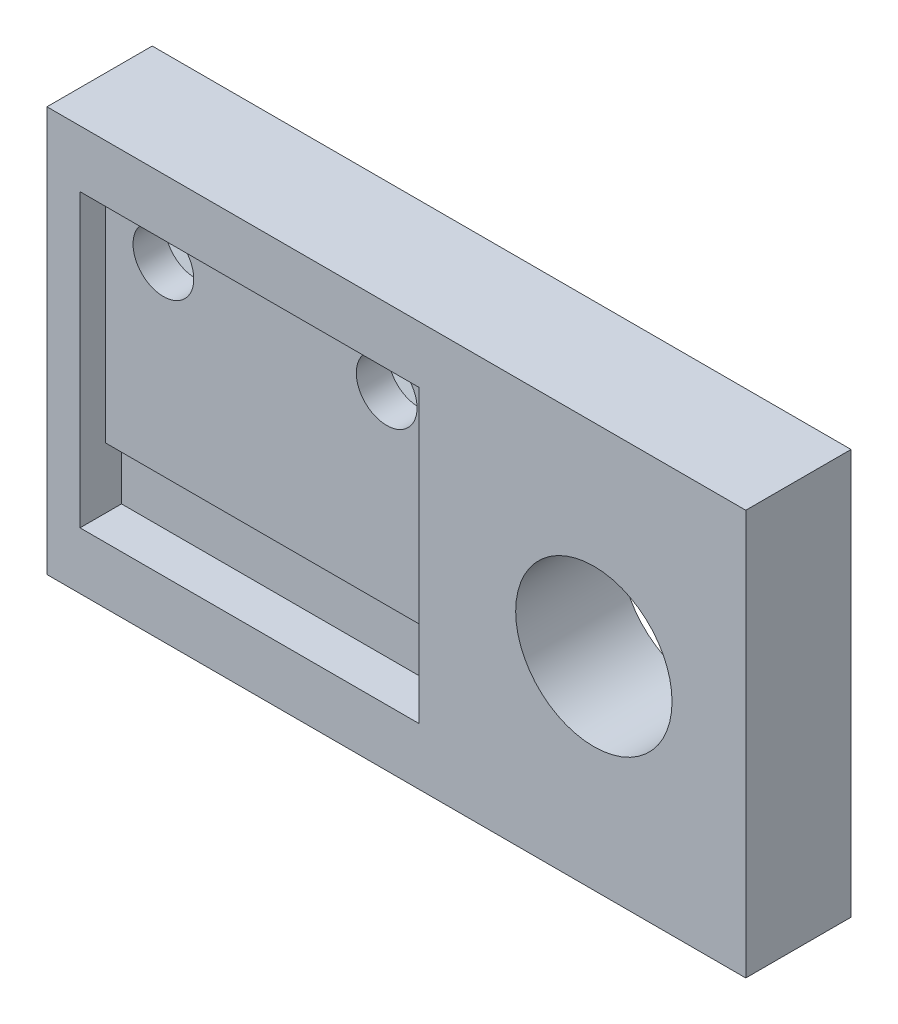
ISO-10303-21;
HEADER;
FILE_DESCRIPTION(('STEP AP214'),'2;1');
FILE_NAME('part.step','',(''),(''),'','','');
FILE_SCHEMA(('AUTOMOTIVE_DESIGN { 1 0 10303 214 1 1 1 1 }'));
ENDSEC;
DATA;
#1=APPLICATION_CONTEXT('core data for automotive mechanical design processes');
#2=APPLICATION_PROTOCOL_DEFINITION('international standard','automotive_design',2000,#1);
#3=PRODUCT_CONTEXT('',#1,'mechanical');
#4=PRODUCT('Part','Part','',(#3));
#5=PRODUCT_RELATED_PRODUCT_CATEGORY('part','',(#4));
#6=PRODUCT_DEFINITION_FORMATION('','',#4);
#7=PRODUCT_DEFINITION_CONTEXT('part definition',#1,'design');
#8=PRODUCT_DEFINITION('design','',#6,#7);
#9=PRODUCT_DEFINITION_SHAPE('','',#8);
#10=(LENGTH_UNIT() NAMED_UNIT(*) SI_UNIT(.MILLI.,.METRE.));
#11=(NAMED_UNIT(*) PLANE_ANGLE_UNIT() SI_UNIT($,.RADIAN.));
#12=(NAMED_UNIT(*) SI_UNIT($,.STERADIAN.) SOLID_ANGLE_UNIT());
#13=UNCERTAINTY_MEASURE_WITH_UNIT(LENGTH_MEASURE(1.E-05),#10,'distance_accuracy_value','');
#14=(GEOMETRIC_REPRESENTATION_CONTEXT(3) GLOBAL_UNCERTAINTY_ASSIGNED_CONTEXT((#13)) GLOBAL_UNIT_ASSIGNED_CONTEXT((#10,
#11,#12)) REPRESENTATION_CONTEXT('',''));
#15=CARTESIAN_POINT('',(0.,0.,0.));
#16=DIRECTION('',(0.,0.,1.));
#17=DIRECTION('',(1.,0.,0.));
#18=AXIS2_PLACEMENT_3D('',#15,#16,#17);
#19=CARTESIAN_POINT('',(0.,0.,0.));
#20=DIRECTION('',(0.,0.,-1.));
#21=DIRECTION('',(-1.,0.,0.));
#22=AXIS2_PLACEMENT_3D('',#19,#20,#21);
#23=PLANE('',#22);
#24=CARTESIAN_POINT('',(19.7,19.05,0.));
#25=DIRECTION('',(0.,0.,1.));
#26=DIRECTION('',(1.,0.,0.));
#27=AXIS2_PLACEMENT_3D('',#24,#25,#26);
#28=CIRCLE('',#27,1.9039967);
#29=CARTESIAN_POINT('',(21.6039967,19.05,0.));
#30=VERTEX_POINT('',#29);
#31=EDGE_CURVE('E428',#30,#30,#28,.T.);
#32=ORIENTED_EDGE('',*,*,#31,.T.);
#33=EDGE_LOOP('',(#32));
#34=FACE_BOUND('',#33,.T.);
#35=DIRECTION('',(-0.866025403784438,-0.5,0.));
#36=VECTOR('',#35,1.);
#37=CARTESIAN_POINT('',(22.8309945,17.2423194825938,0.));
#38=LINE('',#37,#36);
#39=CARTESIAN_POINT('',(22.8309945,17.2423194825938,0.));
#40=VERTEX_POINT('',#39);
#41=CARTESIAN_POINT('',(19.7,15.4346389651875,0.));
#42=VERTEX_POINT('',#41);
#43=EDGE_CURVE('E302',#40,#42,#38,.T.);
#44=ORIENTED_EDGE('',*,*,#43,.T.);
#45=DIRECTION('',(-0.866025403784438,0.5,0.));
#46=VECTOR('',#45,1.);
#47=CARTESIAN_POINT('',(19.7,15.4346389651875,0.));
#48=LINE('',#47,#46);
#49=CARTESIAN_POINT('',(16.5690055,17.2423194825938,0.));
#50=VERTEX_POINT('',#49);
#51=EDGE_CURVE('E297',#42,#50,#48,.T.);
#52=ORIENTED_EDGE('',*,*,#51,.T.);
#53=DIRECTION('',(0.,1.,0.));
#54=VECTOR('',#53,1.);
#55=CARTESIAN_POINT('',(16.5690055,17.2423194825938,0.));
#56=LINE('',#55,#54);
#57=CARTESIAN_POINT('',(16.5690055,20.8576805174062,0.));
#58=VERTEX_POINT('',#57);
#59=EDGE_CURVE('E321',#50,#58,#56,.T.);
#60=ORIENTED_EDGE('',*,*,#59,.T.);
#61=DIRECTION('',(0.866025403784439,0.5,0.));
#62=VECTOR('',#61,1.);
#63=CARTESIAN_POINT('',(16.5690055,20.8576805174062,0.));
#64=LINE('',#63,#62);
#65=CARTESIAN_POINT('',(19.7,22.6653610348125,0.));
#66=VERTEX_POINT('',#65);
#67=EDGE_CURVE('E325',#58,#66,#64,.T.);
#68=ORIENTED_EDGE('',*,*,#67,.T.);
#69=DIRECTION('',(0.866025403784439,-0.5,0.));
#70=VECTOR('',#69,1.);
#71=CARTESIAN_POINT('',(19.7,22.6653610348125,0.));
#72=LINE('',#71,#70);
#73=CARTESIAN_POINT('',(22.8309945,20.8576805174062,0.));
#74=VERTEX_POINT('',#73);
#75=EDGE_CURVE('E329',#66,#74,#72,.T.);
#76=ORIENTED_EDGE('',*,*,#75,.T.);
#77=DIRECTION('',(0.,-1.,0.));
#78=VECTOR('',#77,1.);
#79=CARTESIAN_POINT('',(22.8309945,20.8576805174062,0.));
#80=LINE('',#79,#78);
#81=EDGE_CURVE('E333',#74,#40,#80,.T.);
#82=ORIENTED_EDGE('',*,*,#81,.T.);
#83=EDGE_LOOP('',(#44,#52,#60,#68,#76,#82));
#84=FACE_BOUND('',#83,.T.);
#85=ADVANCED_FACE('F39',(#34,#84),#23,.T.);
#86=CARTESIAN_POINT('',(5.7,19.05,0.));
#87=DIRECTION('',(0.,0.,1.));
#88=DIRECTION('',(1.,0.,0.));
#89=AXIS2_PLACEMENT_3D('',#86,#87,#88);
#90=CIRCLE('',#89,1.9039967);
#91=CARTESIAN_POINT('',(7.6039967,19.05,0.));
#92=VERTEX_POINT('',#91);
#93=EDGE_CURVE('E433',#92,#92,#90,.T.);
#94=ORIENTED_EDGE('',*,*,#93,.T.);
#95=EDGE_LOOP('',(#94));
#96=FACE_BOUND('',#95,.T.);
#97=DIRECTION('',(-0.866025403784438,0.5,0.));
#98=VECTOR('',#97,1.);
#99=CARTESIAN_POINT('',(5.7,15.4346389651875,0.));
#100=LINE('',#99,#98);
#101=CARTESIAN_POINT('',(5.7,15.4346389651875,0.));
#102=VERTEX_POINT('',#101);
#103=CARTESIAN_POINT('',(2.5690055,17.2423194825938,0.));
#104=VERTEX_POINT('',#103);
#105=EDGE_CURVE('E241',#102,#104,#100,.T.);
#106=ORIENTED_EDGE('',*,*,#105,.T.);
#107=DIRECTION('',(0.,1.,0.));
#108=VECTOR('',#107,1.);
#109=CARTESIAN_POINT('',(2.5690055,17.2423194825938,0.));
#110=LINE('',#109,#108);
#111=CARTESIAN_POINT('',(2.5690055,20.8576805174062,0.));
#112=VERTEX_POINT('',#111);
#113=EDGE_CURVE('E234',#104,#112,#110,.T.);
#114=ORIENTED_EDGE('',*,*,#113,.T.);
#115=DIRECTION('',(0.866025403784439,0.5,0.));
#116=VECTOR('',#115,1.);
#117=CARTESIAN_POINT('',(2.5690055,20.8576805174062,0.));
#118=LINE('',#117,#116);
#119=CARTESIAN_POINT('',(5.69999999999999,22.6653610348125,0.));
#120=VERTEX_POINT('',#119);
#121=EDGE_CURVE('E260',#112,#120,#118,.T.);
#122=ORIENTED_EDGE('',*,*,#121,.T.);
#123=DIRECTION('',(0.866025403784439,-0.5,0.));
#124=VECTOR('',#123,1.);
#125=CARTESIAN_POINT('',(5.69999999999999,22.6653610348125,0.));
#126=LINE('',#125,#124);
#127=CARTESIAN_POINT('',(8.83099449999999,20.8576805174062,0.));
#128=VERTEX_POINT('',#127);
#129=EDGE_CURVE('E264',#120,#128,#126,.T.);
#130=ORIENTED_EDGE('',*,*,#129,.T.);
#131=DIRECTION('',(0.,-1.,0.));
#132=VECTOR('',#131,1.);
#133=CARTESIAN_POINT('',(8.83099449999999,20.8576805174062,0.));
#134=LINE('',#133,#132);
#135=CARTESIAN_POINT('',(8.83099449999999,17.2423194825938,0.));
#136=VERTEX_POINT('',#135);
#137=EDGE_CURVE('E268',#128,#136,#134,.T.);
#138=ORIENTED_EDGE('',*,*,#137,.T.);
#139=DIRECTION('',(-0.866025403784438,-0.5,0.));
#140=VECTOR('',#139,1.);
#141=CARTESIAN_POINT('',(8.83099449999999,17.2423194825938,0.));
#142=LINE('',#141,#140);
#143=EDGE_CURVE('E272',#136,#102,#142,.T.);
#144=ORIENTED_EDGE('',*,*,#143,.T.);
#145=EDGE_LOOP('',(#106,#114,#122,#130,#138,#144));
#146=FACE_BOUND('',#145,.T.);
#147=ADVANCED_FACE('F506',(#96,#146),#23,.T.);
#148=CARTESIAN_POINT('',(0.,0.,2.));
#149=DIRECTION('',(0.,0.,-1.));
#150=DIRECTION('',(-1.,0.,0.));
#151=AXIS2_PLACEMENT_3D('',#148,#149,#150);
#152=PLANE('',#151);
#153=DIRECTION('',(0.,-1.,0.));
#154=VECTOR('',#153,1.);
#155=CARTESIAN_POINT('',(2.073,3.573,2.));
#156=LINE('',#155,#154);
#157=CARTESIAN_POINT('',(2.073,21.827,2.));
#158=VERTEX_POINT('',#157);
#159=CARTESIAN_POINT('',(2.073,7.383,2.));
#160=VERTEX_POINT('',#159);
#161=EDGE_CURVE('E387',#158,#160,#156,.T.);
#162=ORIENTED_EDGE('',*,*,#161,.T.);
#163=DIRECTION('',(-1.,0.,0.));
#164=VECTOR('',#163,1.);
#165=CARTESIAN_POINT('',(2.073,7.383,2.));
#166=LINE('',#165,#164);
#167=CARTESIAN_POINT('',(23.327,7.383,2.));
#168=VERTEX_POINT('',#167);
#169=EDGE_CURVE('E220',#168,#160,#166,.T.);
#170=ORIENTED_EDGE('',*,*,#169,.F.);
#171=DIRECTION('',(0.,1.,0.));
#172=VECTOR('',#171,1.);
#173=CARTESIAN_POINT('',(23.327,3.573,2.));
#174=LINE('',#173,#172);
#175=CARTESIAN_POINT('',(23.327,21.827,2.));
#176=VERTEX_POINT('',#175);
#177=EDGE_CURVE('E382',#168,#176,#174,.T.);
#178=ORIENTED_EDGE('',*,*,#177,.T.);
#179=DIRECTION('',(-1.,0.,0.));
#180=VECTOR('',#179,1.);
#181=CARTESIAN_POINT('',(2.073,21.827,2.));
#182=LINE('',#181,#180);
#183=EDGE_CURVE('E397',#176,#158,#182,.T.);
#184=ORIENTED_EDGE('',*,*,#183,.T.);
#185=EDGE_LOOP('',(#162,#170,#178,#184));
#186=FACE_BOUND('',#185,.T.);
#187=CARTESIAN_POINT('',(5.7,19.05,2.));
#188=DIRECTION('',(0.,0.,1.));
#189=DIRECTION('',(1.,0.,0.));
#190=AXIS2_PLACEMENT_3D('',#187,#188,#189);
#191=CIRCLE('',#190,1.9039967);
#192=CARTESIAN_POINT('',(7.6039967,19.05,2.));
#193=VERTEX_POINT('',#192);
#194=EDGE_CURVE('E437',#193,#193,#191,.T.);
#195=ORIENTED_EDGE('',*,*,#194,.F.);
#196=EDGE_LOOP('',(#195));
#197=FACE_BOUND('',#196,.T.);
#198=CARTESIAN_POINT('',(19.7,19.05,2.));
#199=DIRECTION('',(0.,0.,1.));
#200=DIRECTION('',(1.,0.,0.));
#201=AXIS2_PLACEMENT_3D('',#198,#199,#200);
#202=CIRCLE('',#201,1.9039967);
#203=CARTESIAN_POINT('',(21.6039967,19.05,2.));
#204=VERTEX_POINT('',#203);
#205=EDGE_CURVE('E429',#204,#204,#202,.T.);
#206=ORIENTED_EDGE('',*,*,#205,.F.);
#207=EDGE_LOOP('',(#206));
#208=FACE_BOUND('',#207,.T.);
#209=ADVANCED_FACE('F531',(#186,#197,#208),#152,.F.);
#210=CARTESIAN_POINT('',(0.,0.,2.));
#211=DIRECTION('',(1.,0.,0.));
#212=DIRECTION('',(0.,0.,-1.));
#213=AXIS2_PLACEMENT_3D('',#210,#211,#212);
#214=PLANE('',#213);
#215=DIRECTION('',(0.,0.,-1.));
#216=VECTOR('',#215,1.);
#217=CARTESIAN_POINT('',(0.,25.4,2.));
#218=LINE('',#217,#216);
#219=CARTESIAN_POINT('',(0.,25.4,3.6));
#220=VERTEX_POINT('',#219);
#221=CARTESIAN_POINT('',(0.,25.4,-3.));
#222=VERTEX_POINT('',#221);
#223=EDGE_CURVE('E441',#220,#222,#218,.T.);
#224=ORIENTED_EDGE('',*,*,#223,.T.);
#225=DIRECTION('',(0.,1.,0.));
#226=VECTOR('',#225,1.);
#227=CARTESIAN_POINT('',(0.,0.,-3.));
#228=LINE('',#227,#226);
#229=CARTESIAN_POINT('',(0.,0.,-3.));
#230=VERTEX_POINT('',#229);
#231=EDGE_CURVE('E366',#230,#222,#228,.T.);
#232=ORIENTED_EDGE('',*,*,#231,.F.);
#233=DIRECTION('',(0.,0.,-1.));
#234=VECTOR('',#233,1.);
#235=CARTESIAN_POINT('',(0.,0.,2.));
#236=LINE('',#235,#234);
#237=CARTESIAN_POINT('',(0.,0.,3.6));
#238=VERTEX_POINT('',#237);
#239=EDGE_CURVE('E11',#238,#230,#236,.T.);
#240=ORIENTED_EDGE('',*,*,#239,.F.);
#241=DIRECTION('',(0.,-1.,0.));
#242=VECTOR('',#241,1.);
#243=CARTESIAN_POINT('',(0.,25.4,3.6));
#244=LINE('',#243,#242);
#245=EDGE_CURVE('E416',#220,#238,#244,.T.);
#246=ORIENTED_EDGE('',*,*,#245,.F.);
#247=EDGE_LOOP('',(#224,#232,#240,#246));
#248=FACE_BOUND('',#247,.T.);
#249=ADVANCED_FACE('F41',(#248),#214,.F.);
#250=CARTESIAN_POINT('',(0.,0.,2.));
#251=DIRECTION('',(0.,1.,0.));
#252=DIRECTION('',(0.,0.,1.));
#253=AXIS2_PLACEMENT_3D('',#250,#251,#252);
#254=PLANE('',#253);
#255=ORIENTED_EDGE('',*,*,#239,.T.);
#256=DIRECTION('',(-1.,0.,0.));
#257=VECTOR('',#256,1.);
#258=CARTESIAN_POINT('',(43.815,0.,-3.));
#259=LINE('',#258,#257);
#260=CARTESIAN_POINT('',(43.815,0.,-3.));
#261=VERTEX_POINT('',#260);
#262=EDGE_CURVE('E362',#261,#230,#259,.T.);
#263=ORIENTED_EDGE('',*,*,#262,.F.);
#264=DIRECTION('',(0.,0.,-1.));
#265=VECTOR('',#264,1.);
#266=CARTESIAN_POINT('',(43.815,0.,2.));
#267=LINE('',#266,#265);
#268=CARTESIAN_POINT('',(43.815,0.,3.6));
#269=VERTEX_POINT('',#268);
#270=EDGE_CURVE('E48',#269,#261,#267,.T.);
#271=ORIENTED_EDGE('',*,*,#270,.F.);
#272=DIRECTION('',(1.,0.,0.));
#273=VECTOR('',#272,1.);
#274=CARTESIAN_POINT('',(0.,0.,3.6));
#275=LINE('',#274,#273);
#276=EDGE_CURVE('E420',#238,#269,#275,.T.);
#277=ORIENTED_EDGE('',*,*,#276,.F.);
#278=EDGE_LOOP('',(#255,#263,#271,#277));
#279=FACE_BOUND('',#278,.T.);
#280=ADVANCED_FACE('F461',(#279),#254,.F.);
#281=CARTESIAN_POINT('',(43.815,0.,2.));
#282=DIRECTION('',(-1.,0.,0.));
#283=DIRECTION('',(0.,0.,1.));
#284=AXIS2_PLACEMENT_3D('',#281,#282,#283);
#285=PLANE('',#284);
#286=ORIENTED_EDGE('',*,*,#270,.T.);
#287=DIRECTION('',(0.,-1.,0.));
#288=VECTOR('',#287,1.);
#289=CARTESIAN_POINT('',(43.815,25.4,-3.));
#290=LINE('',#289,#288);
#291=CARTESIAN_POINT('',(43.815,25.4,-3.));
#292=VERTEX_POINT('',#291);
#293=EDGE_CURVE('E374',#292,#261,#290,.T.);
#294=ORIENTED_EDGE('',*,*,#293,.F.);
#295=DIRECTION('',(0.,0.,-1.));
#296=VECTOR('',#295,1.);
#297=CARTESIAN_POINT('',(43.815,25.4,2.));
#298=LINE('',#297,#296);
#299=CARTESIAN_POINT('',(43.815,25.4,3.6));
#300=VERTEX_POINT('',#299);
#301=EDGE_CURVE('E447',#300,#292,#298,.T.);
#302=ORIENTED_EDGE('',*,*,#301,.F.);
#303=DIRECTION('',(0.,1.,0.));
#304=VECTOR('',#303,1.);
#305=CARTESIAN_POINT('',(43.815,0.,3.6));
#306=LINE('',#305,#304);
#307=EDGE_CURVE('E424',#269,#300,#306,.T.);
#308=ORIENTED_EDGE('',*,*,#307,.F.);
#309=EDGE_LOOP('',(#286,#294,#302,#308));
#310=FACE_BOUND('',#309,.T.);
#311=ADVANCED_FACE('F453',(#310),#285,.F.);
#312=CARTESIAN_POINT('',(0.,25.4,2.));
#313=DIRECTION('',(0.,-1.,0.));
#314=DIRECTION('',(0.,0.,-1.));
#315=AXIS2_PLACEMENT_3D('',#312,#313,#314);
#316=PLANE('',#315);
#317=ORIENTED_EDGE('',*,*,#301,.T.);
#318=DIRECTION('',(1.,0.,0.));
#319=VECTOR('',#318,1.);
#320=CARTESIAN_POINT('',(0.,25.4,-3.));
#321=LINE('',#320,#319);
#322=EDGE_CURVE('E370',#222,#292,#321,.T.);
#323=ORIENTED_EDGE('',*,*,#322,.F.);
#324=ORIENTED_EDGE('',*,*,#223,.F.);
#325=DIRECTION('',(-1.,0.,0.));
#326=VECTOR('',#325,1.);
#327=CARTESIAN_POINT('',(43.815,25.4,3.6));
#328=LINE('',#327,#326);
#329=EDGE_CURVE('E412',#300,#220,#328,.T.);
#330=ORIENTED_EDGE('',*,*,#329,.F.);
#331=EDGE_LOOP('',(#317,#323,#324,#330));
#332=FACE_BOUND('',#331,.T.);
#333=ADVANCED_FACE('F466',(#332),#316,.F.);
#334=CARTESIAN_POINT('',(5.7,19.05,2.));
#335=DIRECTION('',(0.,0.,-1.));
#336=DIRECTION('',(-1.,0.,0.));
#337=AXIS2_PLACEMENT_3D('',#334,#335,#336);
#338=CYLINDRICAL_SURFACE('',#337,1.9039967);
#339=ORIENTED_EDGE('',*,*,#194,.T.);
#340=EDGE_LOOP('',(#339));
#341=FACE_BOUND('',#340,.T.);
#342=ORIENTED_EDGE('',*,*,#93,.F.);
#343=EDGE_LOOP('',(#342));
#344=FACE_BOUND('',#343,.T.);
#345=ADVANCED_FACE('F539',(#341,#344),#338,.F.);
#346=CARTESIAN_POINT('',(19.7,19.05,2.));
#347=DIRECTION('',(0.,0.,-1.));
#348=DIRECTION('',(-1.,0.,0.));
#349=AXIS2_PLACEMENT_3D('',#346,#347,#348);
#350=CYLINDRICAL_SURFACE('',#349,1.9039967);
#351=ORIENTED_EDGE('',*,*,#205,.T.);
#352=EDGE_LOOP('',(#351));
#353=FACE_BOUND('',#352,.T.);
#354=ORIENTED_EDGE('',*,*,#31,.F.);
#355=EDGE_LOOP('',(#354));
#356=FACE_BOUND('',#355,.T.);
#357=ADVANCED_FACE('F480',(#353,#356),#350,.F.);
#358=CARTESIAN_POINT('',(34.29,12.7,2.));
#359=DIRECTION('',(0.,0.,-1.));
#360=DIRECTION('',(-1.,0.,0.));
#361=AXIS2_PLACEMENT_3D('',#358,#359,#360);
#362=CYLINDRICAL_SURFACE('',#361,4.90220000000001);
#363=CARTESIAN_POINT('',(34.29,12.7,3.6));
#364=DIRECTION('',(0.,0.,1.));
#365=DIRECTION('',(1.,0.,0.));
#366=AXIS2_PLACEMENT_3D('',#363,#364,#365);
#367=CIRCLE('',#366,4.90220000000001);
#368=CARTESIAN_POINT('',(39.1922,12.7,3.6));
#369=VERTEX_POINT('',#368);
#370=EDGE_CURVE('E378',#369,#369,#367,.T.);
#371=ORIENTED_EDGE('',*,*,#370,.T.);
#372=EDGE_LOOP('',(#371));
#373=FACE_BOUND('',#372,.T.);
#374=CARTESIAN_POINT('',(34.29,12.7,-3.));
#375=DIRECTION('',(0.,0.,-1.));
#376=DIRECTION('',(-1.,0.,0.));
#377=AXIS2_PLACEMENT_3D('',#374,#375,#376);
#378=CIRCLE('',#377,4.9022);
#379=CARTESIAN_POINT('',(29.3878,12.7,-3.));
#380=VERTEX_POINT('',#379);
#381=EDGE_CURVE('E358',#380,#380,#378,.T.);
#382=ORIENTED_EDGE('',*,*,#381,.T.);
#383=EDGE_LOOP('',(#382));
#384=FACE_BOUND('',#383,.T.);
#385=ADVANCED_FACE('F473',(#373,#384),#362,.F.);
#386=CARTESIAN_POINT('',(0.,0.,3.6));
#387=DIRECTION('',(0.,0.,1.));
#388=DIRECTION('',(1.,0.,0.));
#389=AXIS2_PLACEMENT_3D('',#386,#387,#388);
#390=PLANE('',#389);
#391=DIRECTION('',(-1.,0.,0.));
#392=VECTOR('',#391,1.);
#393=CARTESIAN_POINT('',(2.073,21.827,3.6));
#394=LINE('',#393,#392);
#395=CARTESIAN_POINT('',(23.327,21.827,3.6));
#396=VERTEX_POINT('',#395);
#397=CARTESIAN_POINT('',(2.073,21.827,3.6));
#398=VERTEX_POINT('',#397);
#399=EDGE_CURVE('E386',#396,#398,#394,.T.);
#400=ORIENTED_EDGE('',*,*,#399,.F.);
#401=DIRECTION('',(0.,1.,0.));
#402=VECTOR('',#401,1.);
#403=CARTESIAN_POINT('',(23.327,3.573,3.6));
#404=LINE('',#403,#402);
#405=CARTESIAN_POINT('',(23.327,3.573,3.6));
#406=VERTEX_POINT('',#405);
#407=EDGE_CURVE('E383',#406,#396,#404,.T.);
#408=ORIENTED_EDGE('',*,*,#407,.F.);
#409=DIRECTION('',(1.,0.,0.));
#410=VECTOR('',#409,1.);
#411=CARTESIAN_POINT('',(2.073,3.573,3.6));
#412=LINE('',#411,#410);
#413=CARTESIAN_POINT('',(2.073,3.573,3.6));
#414=VERTEX_POINT('',#413);
#415=EDGE_CURVE('E392',#414,#406,#412,.T.);
#416=ORIENTED_EDGE('',*,*,#415,.F.);
#417=DIRECTION('',(0.,-1.,0.));
#418=VECTOR('',#417,1.);
#419=CARTESIAN_POINT('',(2.073,3.573,3.6));
#420=LINE('',#419,#418);
#421=EDGE_CURVE('E199',#398,#414,#420,.T.);
#422=ORIENTED_EDGE('',*,*,#421,.F.);
#423=EDGE_LOOP('',(#400,#408,#416,#422));
#424=FACE_BOUND('',#423,.T.);
#425=ORIENTED_EDGE('',*,*,#329,.T.);
#426=ORIENTED_EDGE('',*,*,#245,.T.);
#427=ORIENTED_EDGE('',*,*,#276,.T.);
#428=ORIENTED_EDGE('',*,*,#307,.T.);
#429=EDGE_LOOP('',(#425,#426,#427,#428));
#430=FACE_BOUND('',#429,.T.);
#431=ORIENTED_EDGE('',*,*,#370,.F.);
#432=EDGE_LOOP('',(#431));
#433=FACE_BOUND('',#432,.T.);
#434=ADVANCED_FACE('F469',(#424,#430,#433),#390,.T.);
#435=CARTESIAN_POINT('',(23.327,3.573,3.6));
#436=DIRECTION('',(-1.,0.,0.));
#437=DIRECTION('',(0.,0.,1.));
#438=AXIS2_PLACEMENT_3D('',#435,#436,#437);
#439=PLANE('',#438);
#440=ORIENTED_EDGE('',*,*,#177,.F.);
#441=DIRECTION('',(0.,0.,1.));
#442=VECTOR('',#441,1.);
#443=CARTESIAN_POINT('',(23.327,7.383,1.));
#444=LINE('',#443,#442);
#445=CARTESIAN_POINT('',(23.327,7.383,1.));
#446=VERTEX_POINT('',#445);
#447=EDGE_CURVE('E229',#446,#168,#444,.T.);
#448=ORIENTED_EDGE('',*,*,#447,.F.);
#449=DIRECTION('',(0.,1.,0.));
#450=VECTOR('',#449,1.);
#451=CARTESIAN_POINT('',(23.327,7.383,1.));
#452=LINE('',#451,#450);
#453=CARTESIAN_POINT('',(23.327,3.573,1.));
#454=VERTEX_POINT('',#453);
#455=EDGE_CURVE('E214',#454,#446,#452,.T.);
#456=ORIENTED_EDGE('',*,*,#455,.F.);
#457=DIRECTION('',(0.,0.,-1.));
#458=VECTOR('',#457,1.);
#459=CARTESIAN_POINT('',(23.327,3.573,3.6));
#460=LINE('',#459,#458);
#461=EDGE_CURVE('E204',#406,#454,#460,.T.);
#462=ORIENTED_EDGE('',*,*,#461,.F.);
#463=ORIENTED_EDGE('',*,*,#407,.T.);
#464=DIRECTION('',(0.,0.,-1.));
#465=VECTOR('',#464,1.);
#466=CARTESIAN_POINT('',(23.327,21.827,3.6));
#467=LINE('',#466,#465);
#468=EDGE_CURVE('E408',#396,#176,#467,.T.);
#469=ORIENTED_EDGE('',*,*,#468,.T.);
#470=EDGE_LOOP('',(#440,#448,#456,#462,#463,#469));
#471=FACE_BOUND('',#470,.T.);
#472=ADVANCED_FACE('F472',(#471),#439,.T.);
#473=CARTESIAN_POINT('',(2.073,21.827,3.6));
#474=DIRECTION('',(0.,-1.,0.));
#475=DIRECTION('',(0.,0.,-1.));
#476=AXIS2_PLACEMENT_3D('',#473,#474,#475);
#477=PLANE('',#476);
#478=ORIENTED_EDGE('',*,*,#183,.F.);
#479=ORIENTED_EDGE('',*,*,#468,.F.);
#480=ORIENTED_EDGE('',*,*,#399,.T.);
#481=DIRECTION('',(0.,0.,-1.));
#482=VECTOR('',#481,1.);
#483=CARTESIAN_POINT('',(2.073,21.827,3.6));
#484=LINE('',#483,#482);
#485=EDGE_CURVE('E203',#398,#158,#484,.T.);
#486=ORIENTED_EDGE('',*,*,#485,.T.);
#487=EDGE_LOOP('',(#478,#479,#480,#486));
#488=FACE_BOUND('',#487,.T.);
#489=ADVANCED_FACE('F568',(#488),#477,.T.);
#490=CARTESIAN_POINT('',(2.073,3.573,3.6));
#491=DIRECTION('',(1.,0.,0.));
#492=DIRECTION('',(0.,0.,-1.));
#493=AXIS2_PLACEMENT_3D('',#490,#491,#492);
#494=PLANE('',#493);
#495=ORIENTED_EDGE('',*,*,#161,.F.);
#496=ORIENTED_EDGE('',*,*,#485,.F.);
#497=ORIENTED_EDGE('',*,*,#421,.T.);
#498=DIRECTION('',(0.,0.,-1.));
#499=VECTOR('',#498,1.);
#500=CARTESIAN_POINT('',(2.073,3.573,3.6));
#501=LINE('',#500,#499);
#502=CARTESIAN_POINT('',(2.073,3.573,1.));
#503=VERTEX_POINT('',#502);
#504=EDGE_CURVE('E190',#414,#503,#501,.T.);
#505=ORIENTED_EDGE('',*,*,#504,.T.);
#506=DIRECTION('',(0.,-1.,0.));
#507=VECTOR('',#506,1.);
#508=CARTESIAN_POINT('',(2.073,7.383,1.));
#509=LINE('',#508,#507);
#510=CARTESIAN_POINT('',(2.073,7.383,1.));
#511=VERTEX_POINT('',#510);
#512=EDGE_CURVE('E195',#511,#503,#509,.T.);
#513=ORIENTED_EDGE('',*,*,#512,.F.);
#514=DIRECTION('',(0.,0.,1.));
#515=VECTOR('',#514,1.);
#516=CARTESIAN_POINT('',(2.073,7.383,1.));
#517=LINE('',#516,#515);
#518=EDGE_CURVE('E231',#511,#160,#517,.T.);
#519=ORIENTED_EDGE('',*,*,#518,.T.);
#520=EDGE_LOOP('',(#495,#496,#497,#505,#513,#519));
#521=FACE_BOUND('',#520,.T.);
#522=ADVANCED_FACE('F193',(#521),#494,.T.);
#523=CARTESIAN_POINT('',(2.073,3.573,3.6));
#524=DIRECTION('',(0.,1.,0.));
#525=DIRECTION('',(0.,0.,1.));
#526=AXIS2_PLACEMENT_3D('',#523,#524,#525);
#527=PLANE('',#526);
#528=ORIENTED_EDGE('',*,*,#461,.T.);
#529=DIRECTION('',(1.,0.,0.));
#530=VECTOR('',#529,1.);
#531=CARTESIAN_POINT('',(2.073,3.573,1.));
#532=LINE('',#531,#530);
#533=EDGE_CURVE('E207',#503,#454,#532,.T.);
#534=ORIENTED_EDGE('',*,*,#533,.F.);
#535=ORIENTED_EDGE('',*,*,#504,.F.);
#536=ORIENTED_EDGE('',*,*,#415,.T.);
#537=EDGE_LOOP('',(#528,#534,#535,#536));
#538=FACE_BOUND('',#537,.T.);
#539=ADVANCED_FACE('F208',(#538),#527,.T.);
#540=CARTESIAN_POINT('',(0.,0.,-3.));
#541=DIRECTION('',(0.,0.,-1.));
#542=DIRECTION('',(-1.,0.,0.));
#543=AXIS2_PLACEMENT_3D('',#540,#541,#542);
#544=PLANE('',#543);
#545=ORIENTED_EDGE('',*,*,#262,.T.);
#546=ORIENTED_EDGE('',*,*,#231,.T.);
#547=ORIENTED_EDGE('',*,*,#322,.T.);
#548=ORIENTED_EDGE('',*,*,#293,.T.);
#549=EDGE_LOOP('',(#545,#546,#547,#548));
#550=FACE_BOUND('',#549,.T.);
#551=ORIENTED_EDGE('',*,*,#381,.F.);
#552=EDGE_LOOP('',(#551));
#553=FACE_BOUND('',#552,.T.);
#554=DIRECTION('',(0.,1.,0.));
#555=VECTOR('',#554,1.);
#556=CARTESIAN_POINT('',(16.5690055,17.2423194825938,-3.));
#557=LINE('',#556,#555);
#558=CARTESIAN_POINT('',(16.5690055,17.2423194825938,-3.));
#559=VERTEX_POINT('',#558);
#560=CARTESIAN_POINT('',(16.5690055,20.8576805174062,-3.));
#561=VERTEX_POINT('',#560);
#562=EDGE_CURVE('E301',#559,#561,#557,.T.);
#563=ORIENTED_EDGE('',*,*,#562,.F.);
#564=DIRECTION('',(-0.866025403784438,0.5,0.));
#565=VECTOR('',#564,1.);
#566=CARTESIAN_POINT('',(19.7,15.4346389651875,-3.));
#567=LINE('',#566,#565);
#568=CARTESIAN_POINT('',(19.7,15.4346389651875,-3.));
#569=VERTEX_POINT('',#568);
#570=EDGE_CURVE('E298',#569,#559,#567,.T.);
#571=ORIENTED_EDGE('',*,*,#570,.F.);
#572=DIRECTION('',(-0.866025403784438,-0.5,0.));
#573=VECTOR('',#572,1.);
#574=CARTESIAN_POINT('',(22.8309945,17.2423194825938,-3.));
#575=LINE('',#574,#573);
#576=CARTESIAN_POINT('',(22.8309945,17.2423194825938,-3.));
#577=VERTEX_POINT('',#576);
#578=EDGE_CURVE('E315',#577,#569,#575,.T.);
#579=ORIENTED_EDGE('',*,*,#578,.F.);
#580=DIRECTION('',(0.,-1.,0.));
#581=VECTOR('',#580,1.);
#582=CARTESIAN_POINT('',(22.8309945,20.8576805174062,-3.));
#583=LINE('',#582,#581);
#584=CARTESIAN_POINT('',(22.8309945,20.8576805174062,-3.));
#585=VERTEX_POINT('',#584);
#586=EDGE_CURVE('E311',#585,#577,#583,.T.);
#587=ORIENTED_EDGE('',*,*,#586,.F.);
#588=DIRECTION('',(0.866025403784439,-0.5,0.));
#589=VECTOR('',#588,1.);
#590=CARTESIAN_POINT('',(19.7,22.6653610348125,-3.));
#591=LINE('',#590,#589);
#592=CARTESIAN_POINT('',(19.7,22.6653610348125,-3.));
#593=VERTEX_POINT('',#592);
#594=EDGE_CURVE('E308',#593,#585,#591,.T.);
#595=ORIENTED_EDGE('',*,*,#594,.F.);
#596=DIRECTION('',(0.866025403784439,0.5,0.));
#597=VECTOR('',#596,1.);
#598=CARTESIAN_POINT('',(16.5690055,20.8576805174062,-3.));
#599=LINE('',#598,#597);
#600=EDGE_CURVE('E305',#561,#593,#599,.T.);
#601=ORIENTED_EDGE('',*,*,#600,.F.);
#602=EDGE_LOOP('',(#563,#571,#579,#587,#595,#601));
#603=FACE_BOUND('',#602,.T.);
#604=DIRECTION('',(0.866025403784439,0.5,0.));
#605=VECTOR('',#604,1.);
#606=CARTESIAN_POINT('',(2.5690055,20.8576805174062,-3.));
#607=LINE('',#606,#605);
#608=CARTESIAN_POINT('',(2.5690055,20.8576805174062,-3.));
#609=VERTEX_POINT('',#608);
#610=CARTESIAN_POINT('',(5.69999999999999,22.6653610348125,-3.));
#611=VERTEX_POINT('',#610);
#612=EDGE_CURVE('E240',#609,#611,#607,.T.);
#613=ORIENTED_EDGE('',*,*,#612,.F.);
#614=DIRECTION('',(0.,1.,0.));
#615=VECTOR('',#614,1.);
#616=CARTESIAN_POINT('',(2.5690055,17.2423194825938,-3.));
#617=LINE('',#616,#615);
#618=CARTESIAN_POINT('',(2.5690055,17.2423194825938,-3.));
#619=VERTEX_POINT('',#618);
#620=EDGE_CURVE('E237',#619,#609,#617,.T.);
#621=ORIENTED_EDGE('',*,*,#620,.F.);
#622=DIRECTION('',(-0.866025403784438,0.5,0.));
#623=VECTOR('',#622,1.);
#624=CARTESIAN_POINT('',(5.7,15.4346389651875,-3.));
#625=LINE('',#624,#623);
#626=CARTESIAN_POINT('',(5.7,15.4346389651875,-3.));
#627=VERTEX_POINT('',#626);
#628=EDGE_CURVE('E254',#627,#619,#625,.T.);
#629=ORIENTED_EDGE('',*,*,#628,.F.);
#630=DIRECTION('',(-0.866025403784438,-0.5,0.));
#631=VECTOR('',#630,1.);
#632=CARTESIAN_POINT('',(8.83099449999999,17.2423194825938,-3.));
#633=LINE('',#632,#631);
#634=CARTESIAN_POINT('',(8.83099449999999,17.2423194825938,-3.));
#635=VERTEX_POINT('',#634);
#636=EDGE_CURVE('E250',#635,#627,#633,.T.);
#637=ORIENTED_EDGE('',*,*,#636,.F.);
#638=DIRECTION('',(0.,-1.,0.));
#639=VECTOR('',#638,1.);
#640=CARTESIAN_POINT('',(8.83099449999999,20.8576805174062,-3.));
#641=LINE('',#640,#639);
#642=CARTESIAN_POINT('',(8.83099449999999,20.8576805174062,-3.));
#643=VERTEX_POINT('',#642);
#644=EDGE_CURVE('E247',#643,#635,#641,.T.);
#645=ORIENTED_EDGE('',*,*,#644,.F.);
#646=DIRECTION('',(0.866025403784439,-0.5,0.));
#647=VECTOR('',#646,1.);
#648=CARTESIAN_POINT('',(5.69999999999999,22.6653610348125,-3.));
#649=LINE('',#648,#647);
#650=EDGE_CURVE('E244',#611,#643,#649,.T.);
#651=ORIENTED_EDGE('',*,*,#650,.F.);
#652=EDGE_LOOP('',(#613,#621,#629,#637,#645,#651));
#653=FACE_BOUND('',#652,.T.);
#654=ADVANCED_FACE('F458',(#550,#553,#603,#653),#544,.T.);
#655=CARTESIAN_POINT('',(19.7,15.4346389651875,-3.));
#656=DIRECTION('',(0.5,0.866025403784438,0.));
#657=DIRECTION('',(-0.866025403784438,0.5,0.));
#658=AXIS2_PLACEMENT_3D('',#655,#656,#657);
#659=PLANE('',#658);
#660=ORIENTED_EDGE('',*,*,#51,.F.);
#661=DIRECTION('',(0.,0.,1.));
#662=VECTOR('',#661,1.);
#663=CARTESIAN_POINT('',(19.7,15.4346389651875,-3.));
#664=LINE('',#663,#662);
#665=EDGE_CURVE('E55',#569,#42,#664,.T.);
#666=ORIENTED_EDGE('',*,*,#665,.F.);
#667=ORIENTED_EDGE('',*,*,#570,.T.);
#668=DIRECTION('',(0.,0.,1.));
#669=VECTOR('',#668,1.);
#670=CARTESIAN_POINT('',(16.5690055,17.2423194825938,-3.));
#671=LINE('',#670,#669);
#672=EDGE_CURVE('E354',#559,#50,#671,.T.);
#673=ORIENTED_EDGE('',*,*,#672,.T.);
#674=EDGE_LOOP('',(#660,#666,#667,#673));
#675=FACE_BOUND('',#674,.T.);
#676=ADVANCED_FACE('F485',(#675),#659,.T.);
#677=CARTESIAN_POINT('',(16.5690055,17.2423194825938,-3.));
#678=DIRECTION('',(1.,0.,0.));
#679=DIRECTION('',(0.,0.,-1.));
#680=AXIS2_PLACEMENT_3D('',#677,#678,#679);
#681=PLANE('',#680);
#682=ORIENTED_EDGE('',*,*,#59,.F.);
#683=ORIENTED_EDGE('',*,*,#672,.F.);
#684=ORIENTED_EDGE('',*,*,#562,.T.);
#685=DIRECTION('',(0.,0.,1.));
#686=VECTOR('',#685,1.);
#687=CARTESIAN_POINT('',(16.5690055,20.8576805174062,-3.));
#688=LINE('',#687,#686);
#689=EDGE_CURVE('E351',#561,#58,#688,.T.);
#690=ORIENTED_EDGE('',*,*,#689,.T.);
#691=EDGE_LOOP('',(#682,#683,#684,#690));
#692=FACE_BOUND('',#691,.T.);
#693=ADVANCED_FACE('F579',(#692),#681,.T.);
#694=CARTESIAN_POINT('',(16.5690055,20.8576805174062,-3.));
#695=DIRECTION('',(0.5,-0.866025403784439,0.));
#696=DIRECTION('',(0.866025403784439,0.5,0.));
#697=AXIS2_PLACEMENT_3D('',#694,#695,#696);
#698=PLANE('',#697);
#699=ORIENTED_EDGE('',*,*,#67,.F.);
#700=ORIENTED_EDGE('',*,*,#689,.F.);
#701=ORIENTED_EDGE('',*,*,#600,.T.);
#702=DIRECTION('',(0.,0.,1.));
#703=VECTOR('',#702,1.);
#704=CARTESIAN_POINT('',(19.7,22.6653610348125,-3.));
#705=LINE('',#704,#703);
#706=EDGE_CURVE('E348',#593,#66,#705,.T.);
#707=ORIENTED_EDGE('',*,*,#706,.T.);
#708=EDGE_LOOP('',(#699,#700,#701,#707));
#709=FACE_BOUND('',#708,.T.);
#710=ADVANCED_FACE('F583',(#709),#698,.T.);
#711=CARTESIAN_POINT('',(19.7,22.6653610348125,-3.));
#712=DIRECTION('',(-0.5,-0.866025403784439,0.));
#713=DIRECTION('',(0.866025403784439,-0.5,0.));
#714=AXIS2_PLACEMENT_3D('',#711,#712,#713);
#715=PLANE('',#714);
#716=ORIENTED_EDGE('',*,*,#75,.F.);
#717=ORIENTED_EDGE('',*,*,#706,.F.);
#718=ORIENTED_EDGE('',*,*,#594,.T.);
#719=DIRECTION('',(0.,0.,1.));
#720=VECTOR('',#719,1.);
#721=CARTESIAN_POINT('',(22.8309945,20.8576805174062,-3.));
#722=LINE('',#721,#720);
#723=EDGE_CURVE('E345',#585,#74,#722,.T.);
#724=ORIENTED_EDGE('',*,*,#723,.T.);
#725=EDGE_LOOP('',(#716,#717,#718,#724));
#726=FACE_BOUND('',#725,.T.);
#727=ADVANCED_FACE('F587',(#726),#715,.T.);
#728=CARTESIAN_POINT('',(22.8309945,20.8576805174062,-3.));
#729=DIRECTION('',(-1.,0.,0.));
#730=DIRECTION('',(0.,0.,1.));
#731=AXIS2_PLACEMENT_3D('',#728,#729,#730);
#732=PLANE('',#731);
#733=ORIENTED_EDGE('',*,*,#81,.F.);
#734=ORIENTED_EDGE('',*,*,#723,.F.);
#735=ORIENTED_EDGE('',*,*,#586,.T.);
#736=DIRECTION('',(0.,0.,1.));
#737=VECTOR('',#736,1.);
#738=CARTESIAN_POINT('',(22.8309945,17.2423194825938,-3.));
#739=LINE('',#738,#737);
#740=EDGE_CURVE('E342',#577,#40,#739,.T.);
#741=ORIENTED_EDGE('',*,*,#740,.T.);
#742=EDGE_LOOP('',(#733,#734,#735,#741));
#743=FACE_BOUND('',#742,.T.);
#744=ADVANCED_FACE('F591',(#743),#732,.T.);
#745=CARTESIAN_POINT('',(22.8309945,17.2423194825938,-3.));
#746=DIRECTION('',(-0.5,0.866025403784438,0.));
#747=DIRECTION('',(-0.866025403784438,-0.5,0.));
#748=AXIS2_PLACEMENT_3D('',#745,#746,#747);
#749=PLANE('',#748);
#750=ORIENTED_EDGE('',*,*,#43,.F.);
#751=ORIENTED_EDGE('',*,*,#740,.F.);
#752=ORIENTED_EDGE('',*,*,#578,.T.);
#753=ORIENTED_EDGE('',*,*,#665,.T.);
#754=EDGE_LOOP('',(#750,#751,#752,#753));
#755=FACE_BOUND('',#754,.T.);
#756=ADVANCED_FACE('F595',(#755),#749,.T.);
#757=CARTESIAN_POINT('',(2.5690055,17.2423194825938,-3.));
#758=DIRECTION('',(1.,0.,0.));
#759=DIRECTION('',(0.,0.,-1.));
#760=AXIS2_PLACEMENT_3D('',#757,#758,#759);
#761=PLANE('',#760);
#762=ORIENTED_EDGE('',*,*,#113,.F.);
#763=DIRECTION('',(0.,0.,1.));
#764=VECTOR('',#763,1.);
#765=CARTESIAN_POINT('',(2.5690055,17.2423194825938,-3.));
#766=LINE('',#765,#764);
#767=EDGE_CURVE('E63',#619,#104,#766,.T.);
#768=ORIENTED_EDGE('',*,*,#767,.F.);
#769=ORIENTED_EDGE('',*,*,#620,.T.);
#770=DIRECTION('',(0.,0.,1.));
#771=VECTOR('',#770,1.);
#772=CARTESIAN_POINT('',(2.5690055,20.8576805174062,-3.));
#773=LINE('',#772,#771);
#774=EDGE_CURVE('E293',#609,#112,#773,.T.);
#775=ORIENTED_EDGE('',*,*,#774,.T.);
#776=EDGE_LOOP('',(#762,#768,#769,#775));
#777=FACE_BOUND('',#776,.T.);
#778=ADVANCED_FACE('F508',(#777),#761,.T.);
#779=CARTESIAN_POINT('',(2.5690055,20.8576805174062,-3.));
#780=DIRECTION('',(0.5,-0.866025403784439,0.));
#781=DIRECTION('',(0.866025403784439,0.5,0.));
#782=AXIS2_PLACEMENT_3D('',#779,#780,#781);
#783=PLANE('',#782);
#784=ORIENTED_EDGE('',*,*,#121,.F.);
#785=ORIENTED_EDGE('',*,*,#774,.F.);
#786=ORIENTED_EDGE('',*,*,#612,.T.);
#787=DIRECTION('',(0.,0.,1.));
#788=VECTOR('',#787,1.);
#789=CARTESIAN_POINT('',(5.69999999999999,22.6653610348125,-3.));
#790=LINE('',#789,#788);
#791=EDGE_CURVE('E290',#611,#120,#790,.T.);
#792=ORIENTED_EDGE('',*,*,#791,.T.);
#793=EDGE_LOOP('',(#784,#785,#786,#792));
#794=FACE_BOUND('',#793,.T.);
#795=ADVANCED_FACE('F499',(#794),#783,.T.);
#796=CARTESIAN_POINT('',(5.69999999999999,22.6653610348125,-3.));
#797=DIRECTION('',(-0.5,-0.866025403784439,0.));
#798=DIRECTION('',(0.866025403784439,-0.5,0.));
#799=AXIS2_PLACEMENT_3D('',#796,#797,#798);
#800=PLANE('',#799);
#801=ORIENTED_EDGE('',*,*,#129,.F.);
#802=ORIENTED_EDGE('',*,*,#791,.F.);
#803=ORIENTED_EDGE('',*,*,#650,.T.);
#804=DIRECTION('',(0.,0.,1.));
#805=VECTOR('',#804,1.);
#806=CARTESIAN_POINT('',(8.83099449999999,20.8576805174062,-3.));
#807=LINE('',#806,#805);
#808=EDGE_CURVE('E287',#643,#128,#807,.T.);
#809=ORIENTED_EDGE('',*,*,#808,.T.);
#810=EDGE_LOOP('',(#801,#802,#803,#809));
#811=FACE_BOUND('',#810,.T.);
#812=ADVANCED_FACE('F502',(#811),#800,.T.);
#813=CARTESIAN_POINT('',(8.83099449999999,20.8576805174062,-3.));
#814=DIRECTION('',(-1.,0.,0.));
#815=DIRECTION('',(0.,0.,1.));
#816=AXIS2_PLACEMENT_3D('',#813,#814,#815);
#817=PLANE('',#816);
#818=ORIENTED_EDGE('',*,*,#137,.F.);
#819=ORIENTED_EDGE('',*,*,#808,.F.);
#820=ORIENTED_EDGE('',*,*,#644,.T.);
#821=DIRECTION('',(0.,0.,1.));
#822=VECTOR('',#821,1.);
#823=CARTESIAN_POINT('',(8.83099449999999,17.2423194825938,-3.));
#824=LINE('',#823,#822);
#825=EDGE_CURVE('E284',#635,#136,#824,.T.);
#826=ORIENTED_EDGE('',*,*,#825,.T.);
#827=EDGE_LOOP('',(#818,#819,#820,#826));
#828=FACE_BOUND('',#827,.T.);
#829=ADVANCED_FACE('F516',(#828),#817,.T.);
#830=CARTESIAN_POINT('',(8.83099449999999,17.2423194825938,-3.));
#831=DIRECTION('',(-0.5,0.866025403784439,0.));
#832=DIRECTION('',(-0.866025403784439,-0.5,0.));
#833=AXIS2_PLACEMENT_3D('',#830,#831,#832);
#834=PLANE('',#833);
#835=ORIENTED_EDGE('',*,*,#143,.F.);
#836=ORIENTED_EDGE('',*,*,#825,.F.);
#837=ORIENTED_EDGE('',*,*,#636,.T.);
#838=DIRECTION('',(0.,0.,1.));
#839=VECTOR('',#838,1.);
#840=CARTESIAN_POINT('',(5.7,15.4346389651875,-3.));
#841=LINE('',#840,#839);
#842=EDGE_CURVE('E281',#627,#102,#841,.T.);
#843=ORIENTED_EDGE('',*,*,#842,.T.);
#844=EDGE_LOOP('',(#835,#836,#837,#843));
#845=FACE_BOUND('',#844,.T.);
#846=ADVANCED_FACE('F514',(#845),#834,.T.);
#847=CARTESIAN_POINT('',(5.7,15.4346389651875,-3.));
#848=DIRECTION('',(0.5,0.866025403784438,0.));
#849=DIRECTION('',(-0.866025403784438,0.5,0.));
#850=AXIS2_PLACEMENT_3D('',#847,#848,#849);
#851=PLANE('',#850);
#852=ORIENTED_EDGE('',*,*,#105,.F.);
#853=ORIENTED_EDGE('',*,*,#842,.F.);
#854=ORIENTED_EDGE('',*,*,#628,.T.);
#855=ORIENTED_EDGE('',*,*,#767,.T.);
#856=EDGE_LOOP('',(#852,#853,#854,#855));
#857=FACE_BOUND('',#856,.T.);
#858=ADVANCED_FACE('F510',(#857),#851,.T.);
#859=CARTESIAN_POINT('',(2.073,7.383,1.));
#860=DIRECTION('',(0.,1.,0.));
#861=DIRECTION('',(0.,0.,1.));
#862=AXIS2_PLACEMENT_3D('',#859,#860,#861);
#863=PLANE('',#862);
#864=ORIENTED_EDGE('',*,*,#169,.T.);
#865=ORIENTED_EDGE('',*,*,#518,.F.);
#866=DIRECTION('',(-1.,0.,0.));
#867=VECTOR('',#866,1.);
#868=CARTESIAN_POINT('',(2.073,7.383,1.));
#869=LINE('',#868,#867);
#870=EDGE_CURVE('E218',#446,#511,#869,.T.);
#871=ORIENTED_EDGE('',*,*,#870,.F.);
#872=ORIENTED_EDGE('',*,*,#447,.T.);
#873=EDGE_LOOP('',(#864,#865,#871,#872));
#874=FACE_BOUND('',#873,.T.);
#875=ADVANCED_FACE('F628',(#874),#863,.F.);
#876=CARTESIAN_POINT('',(0.,0.,1.));
#877=DIRECTION('',(0.,0.,1.));
#878=DIRECTION('',(1.,0.,0.));
#879=AXIS2_PLACEMENT_3D('',#876,#877,#878);
#880=PLANE('',#879);
#881=ORIENTED_EDGE('',*,*,#512,.T.);
#882=ORIENTED_EDGE('',*,*,#533,.T.);
#883=ORIENTED_EDGE('',*,*,#455,.T.);
#884=ORIENTED_EDGE('',*,*,#870,.T.);
#885=EDGE_LOOP('',(#881,#882,#883,#884));
#886=FACE_BOUND('',#885,.T.);
#887=ADVANCED_FACE('F216',(#886),#880,.T.);
#888=CLOSED_SHELL('',(#85,#147,#209,#249,#280,#311,#333,#345,#357,#385,#434,#472,#489,#522,#539,
#654,#676,#693,#710,#727,#744,#756,#778,#795,#812,#829,#846,#858,#875,#887));
#889=MANIFOLD_SOLID_BREP('B2',#888);
#890=ADVANCED_BREP_SHAPE_REPRESENTATION('',(#18,#889),#14);
#891=SHAPE_DEFINITION_REPRESENTATION(#9,#890);
ENDSEC;
END-ISO-10303-21;
